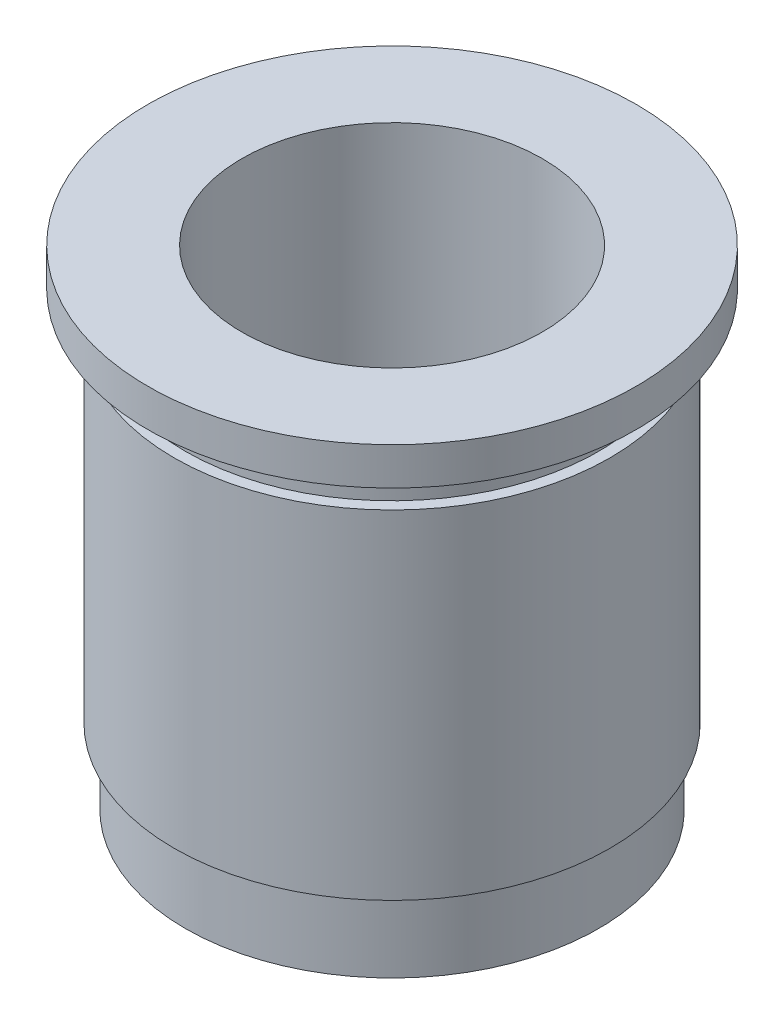
ISO-10303-21;
HEADER;
FILE_DESCRIPTION(('STEP AP214'),'2;1');
FILE_NAME('part.step','',(''),(''),'','','');
FILE_SCHEMA(('AUTOMOTIVE_DESIGN { 1 0 10303 214 1 1 1 1 }'));
ENDSEC;
DATA;
#1=APPLICATION_CONTEXT('core data for automotive mechanical design processes');
#2=APPLICATION_PROTOCOL_DEFINITION('international standard','automotive_design',2000,#1);
#3=PRODUCT_CONTEXT('',#1,'mechanical');
#4=PRODUCT('Part','Part','',(#3));
#5=PRODUCT_RELATED_PRODUCT_CATEGORY('part','',(#4));
#6=PRODUCT_DEFINITION_FORMATION('','',#4);
#7=PRODUCT_DEFINITION_CONTEXT('part definition',#1,'design');
#8=PRODUCT_DEFINITION('design','',#6,#7);
#9=PRODUCT_DEFINITION_SHAPE('','',#8);
#10=(LENGTH_UNIT() NAMED_UNIT(*) SI_UNIT(.MILLI.,.METRE.));
#11=(NAMED_UNIT(*) PLANE_ANGLE_UNIT() SI_UNIT($,.RADIAN.));
#12=(NAMED_UNIT(*) SI_UNIT($,.STERADIAN.) SOLID_ANGLE_UNIT());
#13=UNCERTAINTY_MEASURE_WITH_UNIT(LENGTH_MEASURE(1.E-05),#10,'distance_accuracy_value','');
#14=(GEOMETRIC_REPRESENTATION_CONTEXT(3) GLOBAL_UNCERTAINTY_ASSIGNED_CONTEXT((#13)) GLOBAL_UNIT_ASSIGNED_CONTEXT((#10,
#11,#12)) REPRESENTATION_CONTEXT('',''));
#15=CARTESIAN_POINT('',(0.,0.,0.));
#16=DIRECTION('',(0.,0.,1.));
#17=DIRECTION('',(1.,0.,0.));
#18=AXIS2_PLACEMENT_3D('',#15,#16,#17);
#19=CARTESIAN_POINT('',(0.,0.,0.));
#20=DIRECTION('',(0.,-1.,0.));
#21=DIRECTION('',(0.,0.,-1.));
#22=AXIS2_PLACEMENT_3D('',#19,#20,#21);
#23=CYLINDRICAL_SURFACE('',#22,2.);
#24=CARTESIAN_POINT('',(0.,0.,0.));
#25=DIRECTION('',(0.,-1.,0.));
#26=DIRECTION('',(0.,0.,-1.));
#27=AXIS2_PLACEMENT_3D('',#24,#25,#26);
#28=CIRCLE('',#27,2.);
#29=CARTESIAN_POINT('',(0.,0.,-2.));
#30=VERTEX_POINT('',#29);
#31=EDGE_CURVE('E10',#30,#30,#28,.T.);
#32=ORIENTED_EDGE('',*,*,#31,.T.);
#33=EDGE_LOOP('',(#32));
#34=FACE_BOUND('',#33,.T.);
#35=CARTESIAN_POINT('',(0.,6.5,0.));
#36=DIRECTION('',(0.,-1.,0.));
#37=DIRECTION('',(0.,0.,-1.));
#38=AXIS2_PLACEMENT_3D('',#35,#36,#37);
#39=CIRCLE('',#38,2.);
#40=CARTESIAN_POINT('',(0.,6.5,-2.));
#41=VERTEX_POINT('',#40);
#42=EDGE_CURVE('E82',#41,#41,#39,.T.);
#43=ORIENTED_EDGE('',*,*,#42,.F.);
#44=EDGE_LOOP('',(#43));
#45=FACE_BOUND('',#44,.T.);
#46=ADVANCED_FACE('F39',(#34,#45),#23,.F.);
#47=CARTESIAN_POINT('',(2.,0.,0.));
#48=DIRECTION('',(0.,-1.,0.));
#49=DIRECTION('',(0.,0.,-1.));
#50=AXIS2_PLACEMENT_3D('',#47,#48,#49);
#51=PLANE('',#50);
#52=CARTESIAN_POINT('',(0.,0.,0.));
#53=DIRECTION('',(0.,-1.,0.));
#54=DIRECTION('',(0.,0.,-1.));
#55=AXIS2_PLACEMENT_3D('',#52,#53,#54);
#56=CIRCLE('',#55,2.75);
#57=CARTESIAN_POINT('',(0.,0.,-2.75));
#58=VERTEX_POINT('',#57);
#59=EDGE_CURVE('E46',#58,#58,#56,.T.);
#60=ORIENTED_EDGE('',*,*,#59,.T.);
#61=EDGE_LOOP('',(#60));
#62=FACE_BOUND('',#61,.T.);
#63=ORIENTED_EDGE('',*,*,#31,.F.);
#64=EDGE_LOOP('',(#63));
#65=FACE_BOUND('',#64,.T.);
#66=ADVANCED_FACE('F91',(#62,#65),#51,.T.);
#67=CARTESIAN_POINT('',(0.,0.,0.));
#68=DIRECTION('',(0.,-1.,0.));
#69=DIRECTION('',(0.,0.,-1.));
#70=AXIS2_PLACEMENT_3D('',#67,#68,#69);
#71=CYLINDRICAL_SURFACE('',#70,2.75);
#72=CARTESIAN_POINT('',(0.,1.,0.));
#73=DIRECTION('',(0.,-1.,0.));
#74=DIRECTION('',(0.,0.,-1.));
#75=AXIS2_PLACEMENT_3D('',#72,#73,#74);
#76=CIRCLE('',#75,2.75);
#77=CARTESIAN_POINT('',(0.,1.,-2.75));
#78=VERTEX_POINT('',#77);
#79=EDGE_CURVE('E51',#78,#78,#76,.T.);
#80=ORIENTED_EDGE('',*,*,#79,.T.);
#81=EDGE_LOOP('',(#80));
#82=FACE_BOUND('',#81,.T.);
#83=ORIENTED_EDGE('',*,*,#59,.F.);
#84=EDGE_LOOP('',(#83));
#85=FACE_BOUND('',#84,.T.);
#86=ADVANCED_FACE('F95',(#82,#85),#71,.T.);
#87=CARTESIAN_POINT('',(2.75,1.,0.));
#88=DIRECTION('',(0.,-1.,0.));
#89=DIRECTION('',(0.,0.,-1.));
#90=AXIS2_PLACEMENT_3D('',#87,#88,#89);
#91=PLANE('',#90);
#92=CARTESIAN_POINT('',(0.,1.,0.));
#93=DIRECTION('',(0.,-1.,0.));
#94=DIRECTION('',(0.,0.,-1.));
#95=AXIS2_PLACEMENT_3D('',#92,#93,#94);
#96=CIRCLE('',#95,2.9);
#97=CARTESIAN_POINT('',(0.,1.,-2.9));
#98=VERTEX_POINT('',#97);
#99=EDGE_CURVE('E56',#98,#98,#96,.T.);
#100=ORIENTED_EDGE('',*,*,#99,.T.);
#101=EDGE_LOOP('',(#100));
#102=FACE_BOUND('',#101,.T.);
#103=ORIENTED_EDGE('',*,*,#79,.F.);
#104=EDGE_LOOP('',(#103));
#105=FACE_BOUND('',#104,.T.);
#106=ADVANCED_FACE('F99',(#102,#105),#91,.T.);
#107=CARTESIAN_POINT('',(0.,0.,0.));
#108=DIRECTION('',(0.,-1.,0.));
#109=DIRECTION('',(0.,0.,-1.));
#110=AXIS2_PLACEMENT_3D('',#107,#108,#109);
#111=CYLINDRICAL_SURFACE('',#110,2.9);
#112=CARTESIAN_POINT('',(0.,5.5,0.));
#113=DIRECTION('',(0.,-1.,0.));
#114=DIRECTION('',(0.,0.,-1.));
#115=AXIS2_PLACEMENT_3D('',#112,#113,#114);
#116=CIRCLE('',#115,2.9);
#117=CARTESIAN_POINT('',(0.,5.5,-2.9));
#118=VERTEX_POINT('',#117);
#119=EDGE_CURVE('E62',#118,#118,#116,.T.);
#120=ORIENTED_EDGE('',*,*,#119,.T.);
#121=EDGE_LOOP('',(#120));
#122=FACE_BOUND('',#121,.T.);
#123=ORIENTED_EDGE('',*,*,#99,.F.);
#124=EDGE_LOOP('',(#123));
#125=FACE_BOUND('',#124,.T.);
#126=ADVANCED_FACE('F106',(#122,#125),#111,.T.);
#127=CARTESIAN_POINT('',(2.75,5.5,0.));
#128=DIRECTION('',(0.,1.,0.));
#129=DIRECTION('',(0.,0.,1.));
#130=AXIS2_PLACEMENT_3D('',#127,#128,#129);
#131=PLANE('',#130);
#132=CARTESIAN_POINT('',(0.,5.5,0.));
#133=DIRECTION('',(0.,-1.,0.));
#134=DIRECTION('',(0.,0.,-1.));
#135=AXIS2_PLACEMENT_3D('',#132,#133,#134);
#136=CIRCLE('',#135,2.75);
#137=CARTESIAN_POINT('',(0.,5.5,-2.75));
#138=VERTEX_POINT('',#137);
#139=EDGE_CURVE('E66',#138,#138,#136,.T.);
#140=ORIENTED_EDGE('',*,*,#139,.T.);
#141=EDGE_LOOP('',(#140));
#142=FACE_BOUND('',#141,.T.);
#143=ORIENTED_EDGE('',*,*,#119,.F.);
#144=EDGE_LOOP('',(#143));
#145=FACE_BOUND('',#144,.T.);
#146=ADVANCED_FACE('F110',(#142,#145),#131,.T.);
#147=CARTESIAN_POINT('',(0.,0.,0.));
#148=DIRECTION('',(0.,-1.,0.));
#149=DIRECTION('',(0.,0.,-1.));
#150=AXIS2_PLACEMENT_3D('',#147,#148,#149);
#151=CYLINDRICAL_SURFACE('',#150,2.75);
#152=CARTESIAN_POINT('',(0.,6.,0.));
#153=DIRECTION('',(0.,-1.,0.));
#154=DIRECTION('',(0.,0.,-1.));
#155=AXIS2_PLACEMENT_3D('',#152,#153,#154);
#156=CIRCLE('',#155,2.75);
#157=CARTESIAN_POINT('',(0.,6.,-2.75));
#158=VERTEX_POINT('',#157);
#159=EDGE_CURVE('E70',#158,#158,#156,.T.);
#160=ORIENTED_EDGE('',*,*,#159,.T.);
#161=EDGE_LOOP('',(#160));
#162=FACE_BOUND('',#161,.T.);
#163=ORIENTED_EDGE('',*,*,#139,.F.);
#164=EDGE_LOOP('',(#163));
#165=FACE_BOUND('',#164,.T.);
#166=ADVANCED_FACE('F114',(#162,#165),#151,.T.);
#167=CARTESIAN_POINT('',(2.75,6.,0.));
#168=DIRECTION('',(0.,-1.,0.));
#169=DIRECTION('',(0.,0.,-1.));
#170=AXIS2_PLACEMENT_3D('',#167,#168,#169);
#171=PLANE('',#170);
#172=CARTESIAN_POINT('',(0.,6.,0.));
#173=DIRECTION('',(0.,-1.,0.));
#174=DIRECTION('',(0.,0.,-1.));
#175=AXIS2_PLACEMENT_3D('',#172,#173,#174);
#176=CIRCLE('',#175,3.25);
#177=CARTESIAN_POINT('',(0.,6.,-3.25));
#178=VERTEX_POINT('',#177);
#179=EDGE_CURVE('E74',#178,#178,#176,.T.);
#180=ORIENTED_EDGE('',*,*,#179,.T.);
#181=EDGE_LOOP('',(#180));
#182=FACE_BOUND('',#181,.T.);
#183=ORIENTED_EDGE('',*,*,#159,.F.);
#184=EDGE_LOOP('',(#183));
#185=FACE_BOUND('',#184,.T.);
#186=ADVANCED_FACE('F118',(#182,#185),#171,.T.);
#187=CARTESIAN_POINT('',(0.,0.,0.));
#188=DIRECTION('',(0.,-1.,0.));
#189=DIRECTION('',(0.,0.,-1.));
#190=AXIS2_PLACEMENT_3D('',#187,#188,#189);
#191=CYLINDRICAL_SURFACE('',#190,3.25);
#192=CARTESIAN_POINT('',(0.,6.5,0.));
#193=DIRECTION('',(0.,-1.,0.));
#194=DIRECTION('',(0.,0.,-1.));
#195=AXIS2_PLACEMENT_3D('',#192,#193,#194);
#196=CIRCLE('',#195,3.25);
#197=CARTESIAN_POINT('',(0.,6.5,-3.25));
#198=VERTEX_POINT('',#197);
#199=EDGE_CURVE('E78',#198,#198,#196,.T.);
#200=ORIENTED_EDGE('',*,*,#199,.T.);
#201=EDGE_LOOP('',(#200));
#202=FACE_BOUND('',#201,.T.);
#203=ORIENTED_EDGE('',*,*,#179,.F.);
#204=EDGE_LOOP('',(#203));
#205=FACE_BOUND('',#204,.T.);
#206=ADVANCED_FACE('F122',(#202,#205),#191,.T.);
#207=CARTESIAN_POINT('',(2.,6.5,0.));
#208=DIRECTION('',(0.,1.,0.));
#209=DIRECTION('',(0.,0.,1.));
#210=AXIS2_PLACEMENT_3D('',#207,#208,#209);
#211=PLANE('',#210);
#212=ORIENTED_EDGE('',*,*,#42,.T.);
#213=EDGE_LOOP('',(#212));
#214=FACE_BOUND('',#213,.T.);
#215=ORIENTED_EDGE('',*,*,#199,.F.);
#216=EDGE_LOOP('',(#215));
#217=FACE_BOUND('',#216,.T.);
#218=ADVANCED_FACE('F87',(#214,#217),#211,.T.);
#219=CLOSED_SHELL('',(#46,#66,#86,#106,#126,#146,#166,#186,#206,#218));
#220=MANIFOLD_SOLID_BREP('B2',#219);
#221=ADVANCED_BREP_SHAPE_REPRESENTATION('',(#18,#220),#14);
#222=SHAPE_DEFINITION_REPRESENTATION(#9,#221);
ENDSEC;
END-ISO-10303-21;
